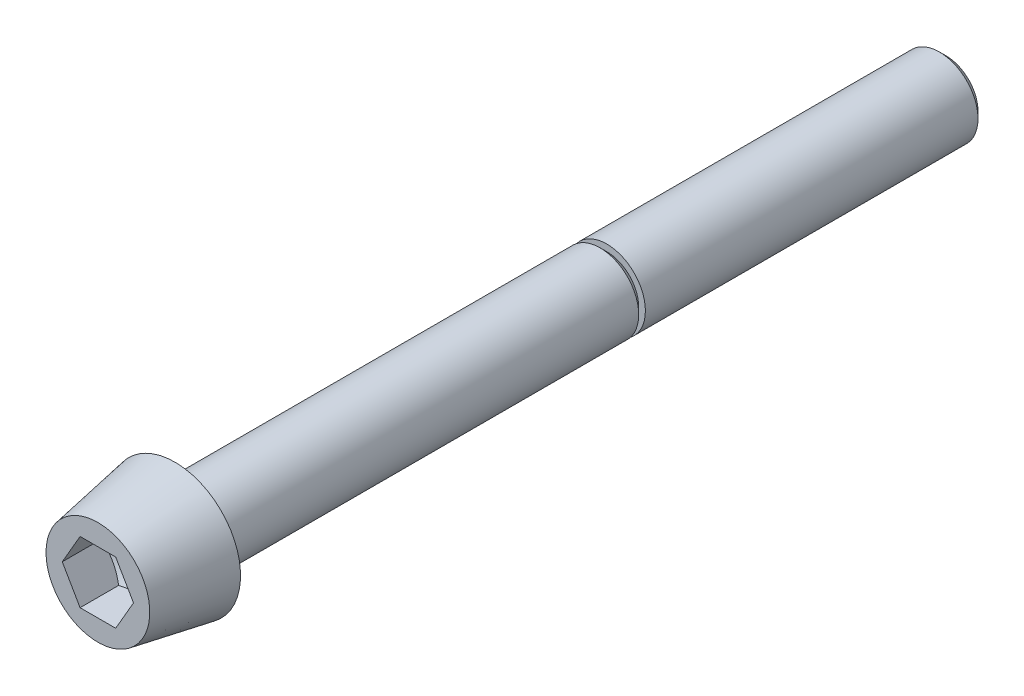
ISO-10303-21;
HEADER;
FILE_DESCRIPTION(('STEP AP214'),'2;1');
FILE_NAME('part.step','',(''),(''),'','','');
FILE_SCHEMA(('AUTOMOTIVE_DESIGN { 1 0 10303 214 1 1 1 1 }'));
ENDSEC;
DATA;
#1=APPLICATION_CONTEXT('core data for automotive mechanical design processes');
#2=APPLICATION_PROTOCOL_DEFINITION('international standard','automotive_design',2000,#1);
#3=PRODUCT_CONTEXT('',#1,'mechanical');
#4=PRODUCT('Part','Part','',(#3));
#5=PRODUCT_RELATED_PRODUCT_CATEGORY('part','',(#4));
#6=PRODUCT_DEFINITION_FORMATION('','',#4);
#7=PRODUCT_DEFINITION_CONTEXT('part definition',#1,'design');
#8=PRODUCT_DEFINITION('design','',#6,#7);
#9=PRODUCT_DEFINITION_SHAPE('','',#8);
#10=(LENGTH_UNIT() NAMED_UNIT(*) SI_UNIT(.MILLI.,.METRE.));
#11=(NAMED_UNIT(*) PLANE_ANGLE_UNIT() SI_UNIT($,.RADIAN.));
#12=(NAMED_UNIT(*) SI_UNIT($,.STERADIAN.) SOLID_ANGLE_UNIT());
#13=UNCERTAINTY_MEASURE_WITH_UNIT(LENGTH_MEASURE(1.E-05),#10,'distance_accuracy_value','');
#14=(GEOMETRIC_REPRESENTATION_CONTEXT(3) GLOBAL_UNCERTAINTY_ASSIGNED_CONTEXT((#13)) GLOBAL_UNIT_ASSIGNED_CONTEXT((#10,
#11,#12)) REPRESENTATION_CONTEXT('',''));
#15=CARTESIAN_POINT('',(0.,0.,0.));
#16=DIRECTION('',(0.,0.,1.));
#17=DIRECTION('',(1.,0.,0.));
#18=AXIS2_PLACEMENT_3D('',#15,#16,#17);
#19=CARTESIAN_POINT('',(0.,0.,0.));
#20=DIRECTION('',(0.,0.,1.));
#21=DIRECTION('',(1.,0.,0.));
#22=AXIS2_PLACEMENT_3D('',#19,#20,#21);
#23=PLANE('',#22);
#24=CARTESIAN_POINT('',(0.,0.,0.));
#25=DIRECTION('',(0.,0.,-1.));
#26=DIRECTION('',(-1.,0.,0.));
#27=AXIS2_PLACEMENT_3D('',#24,#25,#26);
#28=CIRCLE('',#27,4.25);
#29=CARTESIAN_POINT('',(-4.25,0.,0.));
#30=VERTEX_POINT('',#29);
#31=EDGE_CURVE('E180',#30,#30,#28,.T.);
#32=ORIENTED_EDGE('',*,*,#31,.T.);
#33=EDGE_LOOP('',(#32));
#34=FACE_BOUND('',#33,.T.);
#35=CARTESIAN_POINT('',(0.,0.,0.));
#36=DIRECTION('',(0.,0.,1.));
#37=DIRECTION('',(1.,0.,0.));
#38=AXIS2_PLACEMENT_3D('',#35,#36,#37);
#39=CIRCLE('',#38,2.5);
#40=CARTESIAN_POINT('',(2.5,0.,0.));
#41=VERTEX_POINT('',#40);
#42=EDGE_CURVE('E11',#41,#41,#39,.F.);
#43=ORIENTED_EDGE('',*,*,#42,.F.);
#44=EDGE_LOOP('',(#43));
#45=FACE_BOUND('',#44,.T.);
#46=ADVANCED_FACE('F34',(#34,#45),#23,.F.);
#47=CARTESIAN_POINT('',(0.,0.,0.));
#48=DIRECTION('',(0.,0.,1.));
#49=DIRECTION('',(1.,0.,0.));
#50=AXIS2_PLACEMENT_3D('',#47,#48,#49);
#51=CYLINDRICAL_SURFACE('',#50,2.5);
#52=CARTESIAN_POINT('',(0.,0.,-27.567));
#53=DIRECTION('',(0.,0.,1.));
#54=DIRECTION('',(1.,0.,0.));
#55=AXIS2_PLACEMENT_3D('',#52,#53,#54);
#56=CIRCLE('',#55,2.5);
#57=CARTESIAN_POINT('',(2.5,0.,-27.567));
#58=VERTEX_POINT('',#57);
#59=EDGE_CURVE('E136',#58,#58,#56,.T.);
#60=ORIENTED_EDGE('',*,*,#59,.T.);
#61=EDGE_LOOP('',(#60));
#62=FACE_BOUND('',#61,.T.);
#63=ORIENTED_EDGE('',*,*,#42,.T.);
#64=EDGE_LOOP('',(#63));
#65=FACE_BOUND('',#64,.T.);
#66=ADVANCED_FACE('F162',(#62,#65),#51,.T.);
#67=CARTESIAN_POINT('',(0.,0.,-50.));
#68=DIRECTION('',(0.,0.,1.));
#69=DIRECTION('',(1.,0.,0.));
#70=AXIS2_PLACEMENT_3D('',#67,#68,#69);
#71=PLANE('',#70);
#72=CARTESIAN_POINT('',(0.,0.,-50.));
#73=DIRECTION('',(0.,0.,1.));
#74=DIRECTION('',(1.,0.,0.));
#75=AXIS2_PLACEMENT_3D('',#72,#73,#74);
#76=CIRCLE('',#75,2.067);
#77=CARTESIAN_POINT('',(2.067,0.,-50.));
#78=VERTEX_POINT('',#77);
#79=EDGE_CURVE('E43',#78,#78,#76,.T.);
#80=ORIENTED_EDGE('',*,*,#79,.F.);
#81=EDGE_LOOP('',(#80));
#82=FACE_BOUND('',#81,.T.);
#83=ADVANCED_FACE('F160',(#82),#71,.F.);
#84=CARTESIAN_POINT('',(0.,0.,-50.));
#85=DIRECTION('',(0.,0.,1.));
#86=DIRECTION('',(1.,0.,0.));
#87=AXIS2_PLACEMENT_3D('',#84,#85,#86);
#88=CONICAL_SURFACE('',#87,2.067,0.785398163397455);
#89=CARTESIAN_POINT('',(0.,0.,-49.567));
#90=DIRECTION('',(0.,0.,1.));
#91=DIRECTION('',(1.,0.,0.));
#92=AXIS2_PLACEMENT_3D('',#89,#90,#91);
#93=CIRCLE('',#92,2.5);
#94=CARTESIAN_POINT('',(2.5,0.,-49.567));
#95=VERTEX_POINT('',#94);
#96=EDGE_CURVE('E148',#95,#95,#93,.T.);
#97=ORIENTED_EDGE('',*,*,#96,.F.);
#98=EDGE_LOOP('',(#97));
#99=FACE_BOUND('',#98,.T.);
#100=ORIENTED_EDGE('',*,*,#79,.T.);
#101=EDGE_LOOP('',(#100));
#102=FACE_BOUND('',#101,.T.);
#103=ADVANCED_FACE('F158',(#99,#102),#88,.T.);
#104=CARTESIAN_POINT('',(0.,0.,0.));
#105=DIRECTION('',(0.,0.,1.));
#106=DIRECTION('',(1.,0.,0.));
#107=AXIS2_PLACEMENT_3D('',#104,#105,#106);
#108=CYLINDRICAL_SURFACE('',#107,2.5);
#109=CARTESIAN_POINT('',(0.,0.,-28.));
#110=DIRECTION('',(0.,0.,1.));
#111=DIRECTION('',(1.,0.,0.));
#112=AXIS2_PLACEMENT_3D('',#109,#110,#111);
#113=CIRCLE('',#112,2.5);
#114=CARTESIAN_POINT('',(2.5,0.,-28.));
#115=VERTEX_POINT('',#114);
#116=EDGE_CURVE('E144',#115,#115,#113,.T.);
#117=ORIENTED_EDGE('',*,*,#116,.F.);
#118=EDGE_LOOP('',(#117));
#119=FACE_BOUND('',#118,.T.);
#120=ORIENTED_EDGE('',*,*,#96,.T.);
#121=EDGE_LOOP('',(#120));
#122=FACE_BOUND('',#121,.T.);
#123=ADVANCED_FACE('F168',(#119,#122),#108,.T.);
#124=CARTESIAN_POINT('',(0.,2.5,-28.));
#125=DIRECTION('',(0.,0.,-1.));
#126=DIRECTION('',(-1.,0.,0.));
#127=AXIS2_PLACEMENT_3D('',#124,#125,#126);
#128=PLANE('',#127);
#129=CARTESIAN_POINT('',(0.,0.,-28.));
#130=DIRECTION('',(0.,0.,1.));
#131=DIRECTION('',(1.,0.,0.));
#132=AXIS2_PLACEMENT_3D('',#129,#130,#131);
#133=CIRCLE('',#132,2.067);
#134=CARTESIAN_POINT('',(2.067,0.,-28.));
#135=VERTEX_POINT('',#134);
#136=EDGE_CURVE('E140',#135,#135,#133,.T.);
#137=ORIENTED_EDGE('',*,*,#136,.F.);
#138=EDGE_LOOP('',(#137));
#139=FACE_BOUND('',#138,.T.);
#140=ORIENTED_EDGE('',*,*,#116,.T.);
#141=EDGE_LOOP('',(#140));
#142=FACE_BOUND('',#141,.T.);
#143=ADVANCED_FACE('F248',(#139,#142),#128,.F.);
#144=CARTESIAN_POINT('',(0.,0.,-28.));
#145=DIRECTION('',(0.,0.,1.));
#146=DIRECTION('',(1.,0.,0.));
#147=AXIS2_PLACEMENT_3D('',#144,#145,#146);
#148=CONICAL_SURFACE('',#147,2.067,0.785398163397449);
#149=ORIENTED_EDGE('',*,*,#59,.F.);
#150=EDGE_LOOP('',(#149));
#151=FACE_BOUND('',#150,.T.);
#152=ORIENTED_EDGE('',*,*,#136,.T.);
#153=EDGE_LOOP('',(#152));
#154=FACE_BOUND('',#153,.T.);
#155=ADVANCED_FACE('F245',(#151,#154),#148,.T.);
#156=CARTESIAN_POINT('',(0.,0.,5.));
#157=DIRECTION('',(0.,0.,-1.));
#158=DIRECTION('',(-1.,0.,0.));
#159=AXIS2_PLACEMENT_3D('',#156,#157,#158);
#160=CONICAL_SURFACE('',#159,3.36413026913251,0.175354232388203);
#161=ORIENTED_EDGE('',*,*,#31,.F.);
#162=EDGE_LOOP('',(#161));
#163=FACE_BOUND('',#162,.T.);
#164=CARTESIAN_POINT('',(0.,0.,5.));
#165=DIRECTION('',(0.,0.,-1.));
#166=DIRECTION('',(-1.,0.,0.));
#167=AXIS2_PLACEMENT_3D('',#164,#165,#166);
#168=CIRCLE('',#167,3.36413026913251);
#169=CARTESIAN_POINT('',(-3.36413026913251,0.,5.));
#170=VERTEX_POINT('',#169);
#171=EDGE_CURVE('E184',#170,#170,#168,.T.);
#172=ORIENTED_EDGE('',*,*,#171,.T.);
#173=EDGE_LOOP('',(#172));
#174=FACE_BOUND('',#173,.T.);
#175=ADVANCED_FACE('F95',(#163,#174),#160,.T.);
#176=CARTESIAN_POINT('',(0.,0.,1.16666728833348));
#177=DIRECTION('',(0.,0.,1.));
#178=DIRECTION('',(1.,0.,0.));
#179=AXIS2_PLACEMENT_3D('',#176,#177,#178);
#180=CONICAL_SURFACE('',#179,0.,1.0471975511966);
#181=CARTESIAN_POINT('',(0.,0.,1.16666728833348));
#182=VERTEX_POINT('',#181);
#183=VERTEX_LOOP('',#182);
#184=FACE_BOUND('',#183,.T.);
#185=CARTESIAN_POINT('',(2.30940115470054,-2.E-06,2.50000066666717));
#186=CARTESIAN_POINT('',(2.2586590633301,0.0878858803359065,2.4706961706999));
#187=CARTESIAN_POINT('',(2.20747896699173,0.176532407530229,2.44404525693772));
#188=CARTESIAN_POINT('',(2.10423262359364,0.355360319991423,2.39752686821321));
#189=CARTESIAN_POINT('',(2.05216454263161,0.445544881670277,2.37767584793047));
#190=CARTESIAN_POINT('',(1.94867363491875,0.624796391950368,2.3467762774357));
#191=CARTESIAN_POINT('',(1.8972667271894,0.713835767997602,2.33552204992335));
#192=CARTESIAN_POINT('',(1.79421114915164,0.89233326516239,2.32208931802634));
#193=CARTESIAN_POINT('',(1.74256285316985,0.981790737927202,2.31989968755767));
#194=CARTESIAN_POINT('',(1.64606340062569,1.14893269263626,2.32446629100991));
#195=CARTESIAN_POINT('',(1.60119776416565,1.22664225449897,2.33010127235949));
#196=CARTESIAN_POINT('',(1.51175877649126,1.38155512532854,2.34795730960129));
#197=CARTESIAN_POINT('',(1.46718573439589,1.45875789888563,2.36018445922001));
#198=CARTESIAN_POINT('',(1.37756249119973,1.61398990964047,2.39074999235722));
#199=CARTESIAN_POINT('',(1.33252362751513,1.69199950985737,2.40921788183297));
#200=CARTESIAN_POINT('',(1.2431174638359,1.84685552785963,2.45113219321949));
#201=CARTESIAN_POINT('',(1.19874901931202,1.92370392802778,2.47456877313832));
#202=CARTESIAN_POINT('',(1.15469884529946,2.00000106749979,2.50000066666717));
#203=B_SPLINE_CURVE_WITH_KNOTS('',3,(#185,#186,#187,#188,#189,#190,#191,#192,#193,#194,#195,
#196,#197,#198,#199,#200,#201,#202),.UNSPECIFIED.,.F.,.F.,(4,2,2,2,2,2,2,2,4),(0.,
0.317016021868475,0.634793841625281,0.944707629264745,1.2542409089752,1.52370869907371,
1.79342601033586,2.06912439061208,2.34428168581533),.UNSPECIFIED.);
#204=CARTESIAN_POINT('',(2.3094,0.,2.5));
#205=VERTEX_POINT('',#204);
#206=CARTESIAN_POINT('',(1.1547,1.99999906749978,2.5));
#207=VERTEX_POINT('',#206);
#208=EDGE_CURVE('E99',#205,#207,#203,.T.);
#209=ORIENTED_EDGE('',*,*,#208,.T.);
#210=CARTESIAN_POINT('',(-2.99028884971983,1.99999906749978,3.24367023125859));
#211=CARTESIAN_POINT('',(-2.90392200266685,1.99999906749978,3.20223468621355));
#212=CARTESIAN_POINT('',(-2.81734475420192,1.99999906749978,3.16122952382548));
#213=CARTESIAN_POINT('',(-2.64365731596042,1.99999906749978,3.08032411328961));
#214=CARTESIAN_POINT('',(-2.55654703367194,1.99999906749978,3.04042406398872));
#215=CARTESIAN_POINT('',(-2.38118192431167,1.99999906749978,2.96175012614929));
#216=CARTESIAN_POINT('',(-2.29292335976907,1.99999906749978,2.92298453713559));
#217=CARTESIAN_POINT('',(-2.11566562283863,1.99999906749978,2.84719170485446));
#218=CARTESIAN_POINT('',(-2.0266664892431,1.99999906749978,2.81016437120063));
#219=CARTESIAN_POINT('',(-1.84544164627787,1.99999906749978,2.73736806072605));
#220=CARTESIAN_POINT('',(-1.75319241539257,1.99999906749978,2.70165729625577));
#221=CARTESIAN_POINT('',(-1.56757813216984,1.99999906749978,2.6332047864779));
#222=CARTESIAN_POINT('',(-1.47421295183128,1.99999906749978,2.60046338553241));
#223=CARTESIAN_POINT('',(-1.28643386768822,1.99999906749978,2.538885915786));
#224=CARTESIAN_POINT('',(-1.19202295783749,1.99999906749978,2.51004081537766));
#225=CARTESIAN_POINT('',(-1.00184812907594,1.99999906749978,2.45724234487318));
#226=CARTESIAN_POINT('',(-0.906084552528723,1.99999906749978,2.43328775988067));
#227=CARTESIAN_POINT('',(-0.713403648485677,1.99999906749978,2.39154750443783));
#228=CARTESIAN_POINT('',(-0.616489120401837,1.99999906749978,2.37374916380532));
#229=CARTESIAN_POINT('',(-0.421576462996772,1.99999906749978,2.34548602757582));
#230=CARTESIAN_POINT('',(-0.323578407356967,1.99999906749978,2.33502073639873));
#231=CARTESIAN_POINT('',(-0.128212352021127,1.99999906749978,2.32239776567767));
#232=CARTESIAN_POINT('',(-0.0308508716606827,1.99999906749978,2.32014205033526));
#233=CARTESIAN_POINT('',(0.163710831550757,1.99999906749978,2.32386608230561));
#234=CARTESIAN_POINT('',(0.260911044043609,1.99999906749978,2.32984633955668));
#235=CARTESIAN_POINT('',(0.500738265811491,1.99999906749979,2.35423686692871));
#236=CARTESIAN_POINT('',(0.642900579770633,1.99999906749978,2.37721804373175));
#237=CARTESIAN_POINT('',(0.924460633233845,1.99999906749978,2.43647980411871));
#238=CARTESIAN_POINT('',(1.06385482642399,1.99999906749978,2.47277641667854));
#239=CARTESIAN_POINT('',(1.27233418248366,1.99999906749978,2.53477991339468));
#240=CARTESIAN_POINT('',(1.3424969926884,1.99999906749978,2.55699669002916));
#241=CARTESIAN_POINT('',(1.48209226240527,1.99999906749978,2.60348542114602));
#242=CARTESIAN_POINT('',(1.55152514771462,1.99999906749978,2.62775609303869));
#243=CARTESIAN_POINT('',(1.68975335664335,1.99999906749978,2.67800013448867));
#244=CARTESIAN_POINT('',(1.75854879355,1.99999906749978,2.70397319460621));
#245=CARTESIAN_POINT('',(1.89559758268158,1.99999906749978,2.75734107185943));
#246=CARTESIAN_POINT('',(1.9638508410586,1.99999906749978,2.78473612920681));
#247=CARTESIAN_POINT('',(2.13806940290074,1.99999906749979,2.85641772846815));
#248=CARTESIAN_POINT('',(2.24368635497214,1.99999906749978,2.901550016113));
#249=CARTESIAN_POINT('',(2.45396650508346,1.99999906749978,2.99399021983251));
#250=CARTESIAN_POINT('',(2.55862963096903,1.99999906749978,3.04129829888963));
#251=CARTESIAN_POINT('',(2.87150608038439,1.99999906749978,3.18571923402663));
#252=CARTESIAN_POINT('',(3.0785715280017,1.99999906749978,3.28531398238035));
#253=CARTESIAN_POINT('',(3.49093339473319,1.99999906749978,3.48868046682796));
#254=CARTESIAN_POINT('',(3.69622732620256,1.99999906749978,3.5924571873));
#255=CARTESIAN_POINT('',(4.10540863094205,1.99999906749978,3.80267906745961));
#256=CARTESIAN_POINT('',(4.30929617883657,1.99999906749978,3.90912388796881));
#257=CARTESIAN_POINT('',(4.69689964068717,1.99999906749978,4.11371802640448));
#258=CARTESIAN_POINT('',(4.8807031106818,1.99999906749978,4.21170204501137));
#259=CARTESIAN_POINT('',(5.24771880693925,1.99999906749978,4.40878651474632));
#260=CARTESIAN_POINT('',(5.43093101099718,1.99999906749978,4.5078870071899));
#261=CARTESIAN_POINT('',(5.79643447179695,1.99999906749978,4.70667131714161));
#262=CARTESIAN_POINT('',(5.97872688569658,1.99999906749978,4.80635300983316));
#263=CARTESIAN_POINT('',(6.34294316034774,1.99999906749978,5.00636518212678));
#264=CARTESIAN_POINT('',(6.52486703988709,1.99999906749978,5.10669562750368));
#265=CARTESIAN_POINT('',(6.70665851322056,1.99999906749978,5.2072639721148));
#266=B_SPLINE_CURVE_WITH_KNOTS('',3,(#210,#211,#212,#213,#214,#215,#216,#217,#218,#219,#220,
#221,#222,#223,#224,#225,#226,#227,#228,#229,#230,#231,#232,#233,#234,#235,#236,#237,#238,#239,
#240,#241,#242,#243,#244,#245,#246,#247,#248,#249,#250,#251,#252,#253,#254,#255,#256,#257,#258,
#259,#260,#261,#262,#263,#264,#265),.UNSPECIFIED.,.F.,.F.,(4,2,2,2,2,2,2,2,2,2,2,2,2,2,2,2,2,2,
2,2,2,2,2,2,2,2,2,4),(0.,0.287380545294456,0.574812468409967,0.86398796378907,1.15314840582959,
1.44986914395045,1.74662424938927,2.04267922006207,2.33866055535835,2.63402905460955,
2.92937759042407,3.22118738911306,3.51301525630367,3.94415234632139,4.37581014668742,
4.59657452134229,4.81720203911729,5.03778956448221,5.25841447476324,5.60294646675355,
5.94750430884218,6.63673379533742,7.32681057136868,8.01680006289313,8.6416646832095,
9.26655250331282,9.88985091588626,10.513116710133),.UNSPECIFIED.);
#267=CARTESIAN_POINT('',(-1.1547,1.99999906749978,2.5));
#268=VERTEX_POINT('',#267);
#269=EDGE_CURVE('E100',#207,#268,#266,.F.);
#270=ORIENTED_EDGE('',*,*,#269,.T.);
#271=CARTESIAN_POINT('',(-1.15469884529946,2.00000106749979,2.50000066666717));
#272=CARTESIAN_POINT('',(-1.2054409366699,1.91211318716388,2.4706961706999));
#273=CARTESIAN_POINT('',(-1.25662103300827,1.82346665996956,2.44404525693772));
#274=CARTESIAN_POINT('',(-1.35986737640636,1.64463874750836,2.39752686821321));
#275=CARTESIAN_POINT('',(-1.41193545736839,1.55445418582951,2.37767584793046));
#276=CARTESIAN_POINT('',(-1.51542636508125,1.37520267554942,2.3467762774357));
#277=CARTESIAN_POINT('',(-1.5668332728106,1.28616329950218,2.33552204992335));
#278=CARTESIAN_POINT('',(-1.66988885084836,1.10766580233739,2.32208931802633));
#279=CARTESIAN_POINT('',(-1.72153714683015,1.01820832957258,2.31989968755767));
#280=CARTESIAN_POINT('',(-1.81803659937431,0.851066374863522,2.32446629100991));
#281=CARTESIAN_POINT('',(-1.86290223583435,0.773356813000812,2.33010127235949));
#282=CARTESIAN_POINT('',(-1.95234122350874,0.618443942171244,2.34795730960128));
#283=CARTESIAN_POINT('',(-1.99691426560411,0.54124116861415,2.36018445922001));
#284=CARTESIAN_POINT('',(-2.08653750880027,0.38600915785931,2.39074999235722));
#285=CARTESIAN_POINT('',(-2.13157637248487,0.307999557642411,2.40921788183297));
#286=CARTESIAN_POINT('',(-2.2209825361641,0.153143539640155,2.45113219321949));
#287=CARTESIAN_POINT('',(-2.26535098068798,0.0762951394720053,2.47456877313832));
#288=CARTESIAN_POINT('',(-2.30940115470054,-2.0000000006804E-06,2.50000066666717));
#289=B_SPLINE_CURVE_WITH_KNOTS('',3,(#271,#272,#273,#274,#275,#276,#277,#278,#279,#280,#281,
#282,#283,#284,#285,#286,#287,#288),.UNSPECIFIED.,.F.,.F.,(4,2,2,2,2,2,2,2,4),(0.,
0.317016021868475,0.634793841625281,0.944707629264747,1.2542409089752,1.52370869907372,
1.79342601033586,2.06912439061208,2.34428168581533),.UNSPECIFIED.);
#290=CARTESIAN_POINT('',(-2.3094,0.,2.5));
#291=VERTEX_POINT('',#290);
#292=EDGE_CURVE('E58',#268,#291,#289,.T.);
#293=ORIENTED_EDGE('',*,*,#292,.T.);
#294=CARTESIAN_POINT('',(-2.30940115470054,1.99999999948187E-06,2.50000066666717));
#295=CARTESIAN_POINT('',(-2.2586590633301,-0.0878858803359071,2.4706961706999));
#296=CARTESIAN_POINT('',(-2.20747896699173,-0.176532407530229,2.44404525693772));
#297=CARTESIAN_POINT('',(-2.10423262359364,-0.355360319991423,2.39752686821321));
#298=CARTESIAN_POINT('',(-2.05216454263161,-0.445544881670277,2.37767584793047));
#299=CARTESIAN_POINT('',(-1.94867363491875,-0.624796391950368,2.3467762774357));
#300=CARTESIAN_POINT('',(-1.8972667271894,-0.713835767997602,2.33552204992335));
#301=CARTESIAN_POINT('',(-1.79421114915164,-0.89233326516239,2.32208931802634));
#302=CARTESIAN_POINT('',(-1.74256285316985,-0.981790737927202,2.31989968755767));
#303=CARTESIAN_POINT('',(-1.64606340062569,-1.14893269263626,2.32446629100991));
#304=CARTESIAN_POINT('',(-1.60119776416565,-1.22664225449897,2.33010127235949));
#305=CARTESIAN_POINT('',(-1.51175877649126,-1.38155512532854,2.34795730960129));
#306=CARTESIAN_POINT('',(-1.46718573439589,-1.45875789888563,2.36018445922001));
#307=CARTESIAN_POINT('',(-1.37756249119973,-1.61398990964047,2.39074999235722));
#308=CARTESIAN_POINT('',(-1.33252362751513,-1.69199950985737,2.40921788183298));
#309=CARTESIAN_POINT('',(-1.2431174638359,-1.84685552785963,2.4511321932195));
#310=CARTESIAN_POINT('',(-1.19874901931202,-1.92370392802778,2.47456877313832));
#311=CARTESIAN_POINT('',(-1.15469884529946,-2.00000106749979,2.50000066666717));
#312=B_SPLINE_CURVE_WITH_KNOTS('',3,(#294,#295,#296,#297,#298,#299,#300,#301,#302,#303,#304,
#305,#306,#307,#308,#309,#310,#311),.UNSPECIFIED.,.F.,.F.,(4,2,2,2,2,2,2,2,4),(0.,
0.317016021868474,0.63479384162528,0.944707629264745,1.2542409089752,1.52370869907371,
1.79342601033586,2.06912439061208,2.34428168581533),.UNSPECIFIED.);
#313=CARTESIAN_POINT('',(-1.1547,-1.99999906749978,2.5));
#314=VERTEX_POINT('',#313);
#315=EDGE_CURVE('E216',#291,#314,#312,.T.);
#316=ORIENTED_EDGE('',*,*,#315,.T.);
#317=CARTESIAN_POINT('',(-2.99028884971983,-1.99999906749978,3.24367023125859));
#318=CARTESIAN_POINT('',(-2.90392200266685,-1.99999906749978,3.20223468621355));
#319=CARTESIAN_POINT('',(-2.81734475420192,-1.99999906749978,3.16122952382548));
#320=CARTESIAN_POINT('',(-2.64365731596042,-1.99999906749978,3.08032411328961));
#321=CARTESIAN_POINT('',(-2.55654703367194,-1.99999906749978,3.04042406398872));
#322=CARTESIAN_POINT('',(-2.38118192431167,-1.99999906749978,2.96175012614929));
#323=CARTESIAN_POINT('',(-2.29292335976907,-1.99999906749978,2.92298453713559));
#324=CARTESIAN_POINT('',(-2.11566562283863,-1.99999906749978,2.84719170485446));
#325=CARTESIAN_POINT('',(-2.02666648924309,-1.99999906749978,2.81016437120063));
#326=CARTESIAN_POINT('',(-1.84544164627787,-1.99999906749978,2.73736806072605));
#327=CARTESIAN_POINT('',(-1.75319241539257,-1.99999906749978,2.70165729625577));
#328=CARTESIAN_POINT('',(-1.56757813216984,-1.99999906749978,2.6332047864779));
#329=CARTESIAN_POINT('',(-1.47421295183128,-1.99999906749978,2.60046338553241));
#330=CARTESIAN_POINT('',(-1.28643386768821,-1.99999906749978,2.538885915786));
#331=CARTESIAN_POINT('',(-1.19202295783748,-1.99999906749978,2.51004081537766));
#332=CARTESIAN_POINT('',(-1.00184812907594,-1.99999906749978,2.45724234487318));
#333=CARTESIAN_POINT('',(-0.906084552528721,-1.99999906749978,2.43328775988067));
#334=CARTESIAN_POINT('',(-0.713403648485675,-1.99999906749978,2.39154750443783));
#335=CARTESIAN_POINT('',(-0.616489120401835,-1.99999906749978,2.37374916380532));
#336=CARTESIAN_POINT('',(-0.421576462996769,-1.99999906749978,2.34548602757582));
#337=CARTESIAN_POINT('',(-0.323578407356965,-1.99999906749978,2.33502073639873));
#338=CARTESIAN_POINT('',(-0.128212352021125,-1.99999906749978,2.32239776567767));
#339=CARTESIAN_POINT('',(-0.0308508716606805,-1.99999906749978,2.32014205033526));
#340=CARTESIAN_POINT('',(0.163710831550759,-1.99999906749978,2.32386608230561));
#341=CARTESIAN_POINT('',(0.260911044043611,-1.99999906749978,2.32984633955668));
#342=CARTESIAN_POINT('',(0.500738265811493,-1.99999906749979,2.35423686692871));
#343=CARTESIAN_POINT('',(0.642900579770635,-1.99999906749978,2.37721804373175));
#344=CARTESIAN_POINT('',(0.924460633233846,-1.99999906749978,2.43647980411871));
#345=CARTESIAN_POINT('',(1.06385482642399,-1.99999906749978,2.47277641667854));
#346=CARTESIAN_POINT('',(1.27233418248367,-1.99999906749978,2.53477991339468));
#347=CARTESIAN_POINT('',(1.3424969926884,-1.99999906749978,2.55699669002916));
#348=CARTESIAN_POINT('',(1.48209226240527,-1.99999906749978,2.60348542114602));
#349=CARTESIAN_POINT('',(1.55152514771462,-1.99999906749978,2.62775609303869));
#350=CARTESIAN_POINT('',(1.68975335664335,-1.99999906749978,2.67800013448867));
#351=CARTESIAN_POINT('',(1.75854879355,-1.99999906749978,2.70397319460621));
#352=CARTESIAN_POINT('',(1.89559758268158,-1.99999906749978,2.75734107185943));
#353=CARTESIAN_POINT('',(1.9638508410586,-1.99999906749978,2.78473612920681));
#354=CARTESIAN_POINT('',(2.13806940290074,-1.99999906749978,2.85641772846815));
#355=CARTESIAN_POINT('',(2.24368635497214,-1.99999906749978,2.901550016113));
#356=CARTESIAN_POINT('',(2.45396650508346,-1.99999906749978,2.99399021983251));
#357=CARTESIAN_POINT('',(2.55862963096903,-1.99999906749978,3.04129829888963));
#358=CARTESIAN_POINT('',(2.87150608038439,-1.99999906749978,3.18571923402663));
#359=CARTESIAN_POINT('',(3.0785715280017,-1.99999906749978,3.28531398238035));
#360=CARTESIAN_POINT('',(3.49093339473319,-1.99999906749978,3.48868046682796));
#361=CARTESIAN_POINT('',(3.69622732620257,-1.99999906749978,3.5924571873));
#362=CARTESIAN_POINT('',(4.10540863094205,-1.99999906749978,3.80267906745961));
#363=CARTESIAN_POINT('',(4.30929617883657,-1.99999906749978,3.90912388796881));
#364=CARTESIAN_POINT('',(4.69689964068718,-1.99999906749978,4.11371802640448));
#365=CARTESIAN_POINT('',(4.88070311068181,-1.99999906749978,4.21170204501137));
#366=CARTESIAN_POINT('',(5.24771880693925,-1.99999906749978,4.40878651474632));
#367=CARTESIAN_POINT('',(5.43093101099718,-1.99999906749978,4.5078870071899));
#368=CARTESIAN_POINT('',(5.79643447179695,-1.99999906749978,4.70667131714161));
#369=CARTESIAN_POINT('',(5.97872688569658,-1.99999906749978,4.80635300983316));
#370=CARTESIAN_POINT('',(6.34294316034774,-1.99999906749978,5.00636518212678));
#371=CARTESIAN_POINT('',(6.52486703988709,-1.99999906749978,5.10669562750368));
#372=CARTESIAN_POINT('',(6.70665851322056,-1.99999906749978,5.2072639721148));
#373=B_SPLINE_CURVE_WITH_KNOTS('',3,(#317,#318,#319,#320,#321,#322,#323,#324,#325,#326,#327,
#328,#329,#330,#331,#332,#333,#334,#335,#336,#337,#338,#339,#340,#341,#342,#343,#344,#345,#346,
#347,#348,#349,#350,#351,#352,#353,#354,#355,#356,#357,#358,#359,#360,#361,#362,#363,#364,#365,
#366,#367,#368,#369,#370,#371,#372),.UNSPECIFIED.,.F.,.F.,(4,2,2,2,2,2,2,2,2,2,2,2,2,2,2,2,2,2,
2,2,2,2,2,2,2,2,2,4),(0.,0.287380545294455,0.574812468409966,0.863987963789068,1.15314840582959,
1.44986914395045,1.74662424938927,2.04267922006207,2.33866055535835,2.63402905460955,
2.92937759042407,3.22118738911306,3.51301525630367,3.94415234632139,4.37581014668742,
4.59657452134229,4.81720203911729,5.0377895644822,5.25841447476324,5.60294646675355,
5.94750430884218,6.63673379533742,7.32681057136868,8.01680006289313,8.64166468320951,
9.26655250331283,9.88985091588627,10.513116710133),.UNSPECIFIED.);
#374=CARTESIAN_POINT('',(1.1547,-1.99999906749978,2.5));
#375=VERTEX_POINT('',#374);
#376=EDGE_CURVE('E223',#314,#375,#373,.T.);
#377=ORIENTED_EDGE('',*,*,#376,.T.);
#378=CARTESIAN_POINT('',(1.15469884529946,-2.00000106749979,2.50000066666717));
#379=CARTESIAN_POINT('',(1.2054409366699,-1.91211318716388,2.4706961706999));
#380=CARTESIAN_POINT('',(1.25662103300827,-1.82346665996956,2.44404525693772));
#381=CARTESIAN_POINT('',(1.35986737640636,-1.64463874750836,2.39752686821321));
#382=CARTESIAN_POINT('',(1.41193545736839,-1.55445418582951,2.37767584793046));
#383=CARTESIAN_POINT('',(1.51542636508125,-1.37520267554942,2.3467762774357));
#384=CARTESIAN_POINT('',(1.5668332728106,-1.28616329950218,2.33552204992335));
#385=CARTESIAN_POINT('',(1.66988885084836,-1.10766580233739,2.32208931802633));
#386=CARTESIAN_POINT('',(1.72153714683015,-1.01820832957258,2.31989968755767));
#387=CARTESIAN_POINT('',(1.81803659937431,-0.851066374863522,2.32446629100991));
#388=CARTESIAN_POINT('',(1.86290223583435,-0.773356813000813,2.33010127235949));
#389=CARTESIAN_POINT('',(1.95234122350874,-0.618443942171244,2.34795730960128));
#390=CARTESIAN_POINT('',(1.99691426560411,-0.54124116861415,2.36018445922001));
#391=CARTESIAN_POINT('',(2.08653750880027,-0.386009157859311,2.39074999235722));
#392=CARTESIAN_POINT('',(2.13157637248487,-0.307999557642412,2.40921788183297));
#393=CARTESIAN_POINT('',(2.2209825361641,-0.153143539640155,2.45113219321949));
#394=CARTESIAN_POINT('',(2.26535098068798,-0.0762951394720057,2.47456877313831));
#395=CARTESIAN_POINT('',(2.30940115470054,1.99999999989533E-06,2.50000066666717));
#396=B_SPLINE_CURVE_WITH_KNOTS('',3,(#378,#379,#380,#381,#382,#383,#384,#385,#386,#387,#388,
#389,#390,#391,#392,#393,#394,#395),.UNSPECIFIED.,.F.,.F.,(4,2,2,2,2,2,2,2,4),(0.,
0.317016021868475,0.634793841625281,0.944707629264746,1.2542409089752,1.52370869907371,
1.79342601033586,2.06912439061208,2.34428168581533),.UNSPECIFIED.);
#397=EDGE_CURVE('E103',#375,#205,#396,.T.);
#398=ORIENTED_EDGE('',*,*,#397,.T.);
#399=EDGE_LOOP('',(#209,#270,#293,#316,#377,#398));
#400=FACE_BOUND('',#399,.T.);
#401=ADVANCED_FACE('F91',(#184,#400),#180,.F.);
#402=CARTESIAN_POINT('',(-1.1547,1.99999906749978,1.16666728833348));
#403=DIRECTION('',(0.,-1.,0.));
#404=DIRECTION('',(-1.,0.,0.));
#405=AXIS2_PLACEMENT_3D('',#402,#403,#404);
#406=PLANE('',#405);
#407=DIRECTION('',(0.,0.,1.));
#408=VECTOR('',#407,1.);
#409=CARTESIAN_POINT('',(1.1547,1.99999906749978,1.16666728833348));
#410=LINE('',#409,#408);
#411=CARTESIAN_POINT('',(1.1547,1.99999906749978,5.));
#412=VERTEX_POINT('',#411);
#413=EDGE_CURVE('E107',#207,#412,#410,.T.);
#414=ORIENTED_EDGE('',*,*,#413,.T.);
#415=DIRECTION('',(1.,0.,0.));
#416=VECTOR('',#415,1.);
#417=CARTESIAN_POINT('',(-1.1547,1.99999906749978,5.));
#418=LINE('',#417,#416);
#419=CARTESIAN_POINT('',(-1.1547,1.99999906749978,5.));
#420=VERTEX_POINT('',#419);
#421=EDGE_CURVE('E114',#420,#412,#418,.T.);
#422=ORIENTED_EDGE('',*,*,#421,.F.);
#423=DIRECTION('',(0.,0.,1.));
#424=VECTOR('',#423,1.);
#425=CARTESIAN_POINT('',(-1.1547,1.99999906749978,1.16666728833348));
#426=LINE('',#425,#424);
#427=EDGE_CURVE('E113',#268,#420,#426,.T.);
#428=ORIENTED_EDGE('',*,*,#427,.F.);
#429=ORIENTED_EDGE('',*,*,#269,.F.);
#430=EDGE_LOOP('',(#414,#422,#428,#429));
#431=FACE_BOUND('',#430,.T.);
#432=ADVANCED_FACE('F94',(#431),#406,.T.);
#433=CARTESIAN_POINT('',(-2.3094,0.,1.16666728833348));
#434=DIRECTION('',(0.866025403784439,-0.5,0.));
#435=DIRECTION('',(-0.5,-0.866025403784439,0.));
#436=AXIS2_PLACEMENT_3D('',#433,#434,#435);
#437=PLANE('',#436);
#438=ORIENTED_EDGE('',*,*,#427,.T.);
#439=DIRECTION('',(0.5,0.866025403784439,0.));
#440=VECTOR('',#439,1.);
#441=CARTESIAN_POINT('',(-2.3094,0.,5.));
#442=LINE('',#441,#440);
#443=CARTESIAN_POINT('',(-2.3094,0.,5.));
#444=VERTEX_POINT('',#443);
#445=EDGE_CURVE('E122',#444,#420,#442,.T.);
#446=ORIENTED_EDGE('',*,*,#445,.F.);
#447=DIRECTION('',(0.,0.,1.));
#448=VECTOR('',#447,1.);
#449=CARTESIAN_POINT('',(-2.3094,0.,1.16666728833348));
#450=LINE('',#449,#448);
#451=EDGE_CURVE('E119',#291,#444,#450,.T.);
#452=ORIENTED_EDGE('',*,*,#451,.F.);
#453=ORIENTED_EDGE('',*,*,#292,.F.);
#454=EDGE_LOOP('',(#438,#446,#452,#453));
#455=FACE_BOUND('',#454,.T.);
#456=ADVANCED_FACE('F204',(#455),#437,.T.);
#457=CARTESIAN_POINT('',(-1.1547,-1.99999906749978,1.16666728833348));
#458=DIRECTION('',(0.866025403784438,0.5,0.));
#459=DIRECTION('',(0.5,-0.866025403784439,0.));
#460=AXIS2_PLACEMENT_3D('',#457,#458,#459);
#461=PLANE('',#460);
#462=ORIENTED_EDGE('',*,*,#451,.T.);
#463=DIRECTION('',(-0.5,0.866025403784439,0.));
#464=VECTOR('',#463,1.);
#465=CARTESIAN_POINT('',(-1.1547,-1.99999906749978,5.));
#466=LINE('',#465,#464);
#467=CARTESIAN_POINT('',(-1.1547,-1.99999906749978,5.));
#468=VERTEX_POINT('',#467);
#469=EDGE_CURVE('E403',#468,#444,#466,.T.);
#470=ORIENTED_EDGE('',*,*,#469,.F.);
#471=DIRECTION('',(0.,0.,1.));
#472=VECTOR('',#471,1.);
#473=CARTESIAN_POINT('',(-1.1547,-1.99999906749978,1.16666728833348));
#474=LINE('',#473,#472);
#475=EDGE_CURVE('E128',#314,#468,#474,.T.);
#476=ORIENTED_EDGE('',*,*,#475,.F.);
#477=ORIENTED_EDGE('',*,*,#315,.F.);
#478=EDGE_LOOP('',(#462,#470,#476,#477));
#479=FACE_BOUND('',#478,.T.);
#480=ADVANCED_FACE('F208',(#479),#461,.T.);
#481=CARTESIAN_POINT('',(1.1547,-1.99999906749978,1.16666728833348));
#482=DIRECTION('',(0.,1.,0.));
#483=DIRECTION('',(1.,0.,0.));
#484=AXIS2_PLACEMENT_3D('',#481,#482,#483);
#485=PLANE('',#484);
#486=ORIENTED_EDGE('',*,*,#475,.T.);
#487=DIRECTION('',(-1.,0.,0.));
#488=VECTOR('',#487,1.);
#489=CARTESIAN_POINT('',(1.1547,-1.99999906749978,5.));
#490=LINE('',#489,#488);
#491=CARTESIAN_POINT('',(1.1547,-1.99999906749978,5.));
#492=VERTEX_POINT('',#491);
#493=EDGE_CURVE('E407',#492,#468,#490,.T.);
#494=ORIENTED_EDGE('',*,*,#493,.F.);
#495=DIRECTION('',(0.,0.,1.));
#496=VECTOR('',#495,1.);
#497=CARTESIAN_POINT('',(1.1547,-1.99999906749978,1.16666728833348));
#498=LINE('',#497,#496);
#499=EDGE_CURVE('E131',#375,#492,#498,.T.);
#500=ORIENTED_EDGE('',*,*,#499,.F.);
#501=ORIENTED_EDGE('',*,*,#376,.F.);
#502=EDGE_LOOP('',(#486,#494,#500,#501));
#503=FACE_BOUND('',#502,.T.);
#504=ADVANCED_FACE('F212',(#503),#485,.T.);
#505=CARTESIAN_POINT('',(2.3094,0.,1.16666728833348));
#506=DIRECTION('',(-0.866025403784439,0.5,0.));
#507=DIRECTION('',(0.5,0.866025403784439,0.));
#508=AXIS2_PLACEMENT_3D('',#505,#506,#507);
#509=PLANE('',#508);
#510=ORIENTED_EDGE('',*,*,#499,.T.);
#511=DIRECTION('',(-0.5,-0.866025403784439,0.));
#512=VECTOR('',#511,1.);
#513=CARTESIAN_POINT('',(2.3094,0.,5.));
#514=LINE('',#513,#512);
#515=CARTESIAN_POINT('',(2.3094,0.,5.));
#516=VERTEX_POINT('',#515);
#517=EDGE_CURVE('E410',#516,#492,#514,.T.);
#518=ORIENTED_EDGE('',*,*,#517,.F.);
#519=DIRECTION('',(0.,0.,1.));
#520=VECTOR('',#519,1.);
#521=CARTESIAN_POINT('',(2.3094,0.,1.16666728833348));
#522=LINE('',#521,#520);
#523=EDGE_CURVE('E134',#205,#516,#522,.T.);
#524=ORIENTED_EDGE('',*,*,#523,.F.);
#525=ORIENTED_EDGE('',*,*,#397,.F.);
#526=EDGE_LOOP('',(#510,#518,#524,#525));
#527=FACE_BOUND('',#526,.T.);
#528=ADVANCED_FACE('F238',(#527),#509,.T.);
#529=CARTESIAN_POINT('',(1.1547,1.99999906749978,1.16666728833348));
#530=DIRECTION('',(-0.866025403784438,-0.5,0.));
#531=DIRECTION('',(-0.5,0.866025403784439,0.));
#532=AXIS2_PLACEMENT_3D('',#529,#530,#531);
#533=PLANE('',#532);
#534=ORIENTED_EDGE('',*,*,#523,.T.);
#535=DIRECTION('',(0.5,-0.866025403784439,0.));
#536=VECTOR('',#535,1.);
#537=CARTESIAN_POINT('',(1.1547,1.99999906749978,5.));
#538=LINE('',#537,#536);
#539=EDGE_CURVE('E50',#412,#516,#538,.T.);
#540=ORIENTED_EDGE('',*,*,#539,.F.);
#541=ORIENTED_EDGE('',*,*,#413,.F.);
#542=ORIENTED_EDGE('',*,*,#208,.F.);
#543=EDGE_LOOP('',(#534,#540,#541,#542));
#544=FACE_BOUND('',#543,.T.);
#545=ADVANCED_FACE('F108',(#544),#533,.T.);
#546=CARTESIAN_POINT('',(0.,3.825,5.));
#547=DIRECTION('',(0.,0.,-1.));
#548=DIRECTION('',(-1.,0.,0.));
#549=AXIS2_PLACEMENT_3D('',#546,#547,#548);
#550=PLANE('',#549);
#551=ORIENTED_EDGE('',*,*,#171,.F.);
#552=EDGE_LOOP('',(#551));
#553=FACE_BOUND('',#552,.T.);
#554=ORIENTED_EDGE('',*,*,#539,.T.);
#555=ORIENTED_EDGE('',*,*,#517,.T.);
#556=ORIENTED_EDGE('',*,*,#493,.T.);
#557=ORIENTED_EDGE('',*,*,#469,.T.);
#558=ORIENTED_EDGE('',*,*,#445,.T.);
#559=ORIENTED_EDGE('',*,*,#421,.T.);
#560=EDGE_LOOP('',(#554,#555,#556,#557,#558,#559));
#561=FACE_BOUND('',#560,.T.);
#562=ADVANCED_FACE('F36',(#553,#561),#550,.F.);
#563=CLOSED_SHELL('',(#46,#66,#83,#103,#123,#143,#155,#175,#401,#432,#456,#480,#504,#528,#545,#562));
#564=MANIFOLD_SOLID_BREP('B2',#563);
#565=ADVANCED_BREP_SHAPE_REPRESENTATION('',(#18,#564),#14);
#566=SHAPE_DEFINITION_REPRESENTATION(#9,#565);
ENDSEC;
END-ISO-10303-21;
